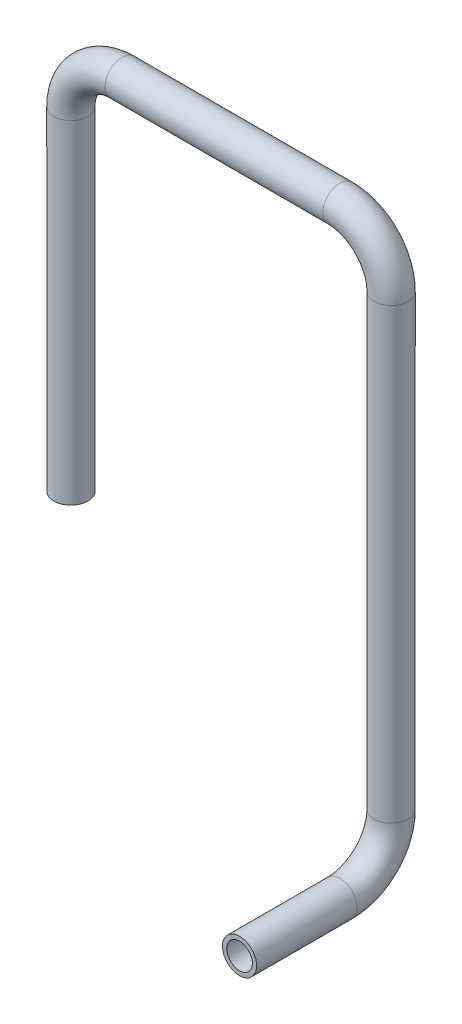
ISO-10303-21;
HEADER;
FILE_DESCRIPTION(('STEP AP214'),'2;1');
FILE_NAME('part.step','',(''),(''),'','','');
FILE_SCHEMA(('AUTOMOTIVE_DESIGN { 1 0 10303 214 1 1 1 1 }'));
ENDSEC;
DATA;
#1=APPLICATION_CONTEXT('core data for automotive mechanical design processes');
#2=APPLICATION_PROTOCOL_DEFINITION('international standard','automotive_design',2000,#1);
#3=PRODUCT_CONTEXT('',#1,'mechanical');
#4=PRODUCT('Part','Part','',(#3));
#5=PRODUCT_RELATED_PRODUCT_CATEGORY('part','',(#4));
#6=PRODUCT_DEFINITION_FORMATION('','',#4);
#7=PRODUCT_DEFINITION_CONTEXT('part definition',#1,'design');
#8=PRODUCT_DEFINITION('design','',#6,#7);
#9=PRODUCT_DEFINITION_SHAPE('','',#8);
#10=(LENGTH_UNIT() NAMED_UNIT(*) SI_UNIT(.MILLI.,.METRE.));
#11=(NAMED_UNIT(*) PLANE_ANGLE_UNIT() SI_UNIT($,.RADIAN.));
#12=(NAMED_UNIT(*) SI_UNIT($,.STERADIAN.) SOLID_ANGLE_UNIT());
#13=UNCERTAINTY_MEASURE_WITH_UNIT(LENGTH_MEASURE(1.E-05),#10,'distance_accuracy_value','');
#14=(GEOMETRIC_REPRESENTATION_CONTEXT(3) GLOBAL_UNCERTAINTY_ASSIGNED_CONTEXT((#13)) GLOBAL_UNIT_ASSIGNED_CONTEXT((#10,
#11,#12)) REPRESENTATION_CONTEXT('',''));
#15=CARTESIAN_POINT('',(0.,0.,0.));
#16=DIRECTION('',(0.,0.,1.));
#17=DIRECTION('',(1.,0.,0.));
#18=AXIS2_PLACEMENT_3D('',#15,#16,#17);
#19=CARTESIAN_POINT('',(180.,21.,-89.5));
#20=DIRECTION('',(0.,0.,1.));
#21=DIRECTION('',(0.,1.,0.));
#22=AXIS2_PLACEMENT_3D('',#19,#20,#21);
#23=PLANE('',#22);
#24=CARTESIAN_POINT('',(180.,21.,-89.5));
#25=DIRECTION('',(0.,0.,1.));
#26=DIRECTION('',(0.,1.,0.));
#27=AXIS2_PLACEMENT_3D('',#24,#25,#26);
#28=CIRCLE('',#27,3.);
#29=CARTESIAN_POINT('',(180.,24.,-89.5));
#30=VERTEX_POINT('',#29);
#31=EDGE_CURVE('E263',#30,#30,#28,.T.);
#32=ORIENTED_EDGE('',*,*,#31,.F.);
#33=EDGE_LOOP('',(#32));
#34=FACE_BOUND('',#33,.T.);
#35=CARTESIAN_POINT('',(180.,21.,-89.5));
#36=DIRECTION('',(0.,0.,1.));
#37=DIRECTION('',(1.,0.,0.));
#38=AXIS2_PLACEMENT_3D('',#35,#36,#37);
#39=CIRCLE('',#38,4.);
#40=CARTESIAN_POINT('',(184.,21.,-89.5));
#41=VERTEX_POINT('',#40);
#42=EDGE_CURVE('E75',#41,#41,#39,.T.);
#43=ORIENTED_EDGE('',*,*,#42,.T.);
#44=EDGE_LOOP('',(#43));
#45=FACE_BOUND('',#44,.T.);
#46=ADVANCED_FACE('F52',(#34,#45),#23,.T.);
#47=CARTESIAN_POINT('',(105.,60.,-125.));
#48=DIRECTION('',(0.,1.,0.));
#49=DIRECTION('',(0.,0.,1.));
#50=AXIS2_PLACEMENT_3D('',#47,#48,#49);
#51=PLANE('',#50);
#52=CARTESIAN_POINT('',(105.,60.,-125.));
#53=DIRECTION('',(0.,1.,0.));
#54=DIRECTION('',(0.,0.,1.));
#55=AXIS2_PLACEMENT_3D('',#52,#53,#54);
#56=CIRCLE('',#55,3.);
#57=CARTESIAN_POINT('',(105.,60.,-122.));
#58=VERTEX_POINT('',#57);
#59=EDGE_CURVE('E73',#58,#58,#56,.T.);
#60=ORIENTED_EDGE('',*,*,#59,.T.);
#61=EDGE_LOOP('',(#60));
#62=FACE_BOUND('',#61,.T.);
#63=CARTESIAN_POINT('',(105.,60.,-125.));
#64=DIRECTION('',(0.,1.,0.));
#65=DIRECTION('',(0.,0.,1.));
#66=AXIS2_PLACEMENT_3D('',#63,#64,#65);
#67=CIRCLE('',#66,4.);
#68=CARTESIAN_POINT('',(105.,60.,-121.));
#69=VERTEX_POINT('',#68);
#70=EDGE_CURVE('E11',#69,#69,#67,.T.);
#71=ORIENTED_EDGE('',*,*,#70,.F.);
#72=EDGE_LOOP('',(#71));
#73=FACE_BOUND('',#72,.T.);
#74=ADVANCED_FACE('F149',(#62,#73),#51,.F.);
#75=CARTESIAN_POINT('',(180.,21.,-89.5));
#76=DIRECTION('',(0.,0.,-1.));
#77=DIRECTION('',(-1.,0.,0.));
#78=AXIS2_PLACEMENT_3D('',#75,#76,#77);
#79=CYLINDRICAL_SURFACE('',#78,4.);
#80=CARTESIAN_POINT('',(180.,21.,-113.));
#81=DIRECTION('',(0.,0.,-1.));
#82=DIRECTION('',(-1.,0.,0.));
#83=AXIS2_PLACEMENT_3D('',#80,#81,#82);
#84=CIRCLE('',#83,4.);
#85=CARTESIAN_POINT('',(180.,17.,-113.));
#86=VERTEX_POINT('',#85);
#87=EDGE_CURVE('E74',#86,#86,#84,.F.);
#88=ORIENTED_EDGE('',*,*,#87,.T.);
#89=EDGE_LOOP('',(#88));
#90=FACE_BOUND('',#89,.T.);
#91=ORIENTED_EDGE('',*,*,#42,.F.);
#92=EDGE_LOOP('',(#91));
#93=FACE_BOUND('',#92,.T.);
#94=ADVANCED_FACE('F155',(#90,#93),#79,.T.);
#95=CARTESIAN_POINT('',(180.,33.,-113.));
#96=DIRECTION('',(1.,0.,0.));
#97=DIRECTION('',(0.,0.,-1.));
#98=AXIS2_PLACEMENT_3D('',#95,#96,#97);
#99=TOROIDAL_SURFACE('',#98,12.,4.);
#100=CARTESIAN_POINT('',(180.,33.,-125.));
#101=DIRECTION('',(0.,-1.,0.));
#102=DIRECTION('',(0.,0.,-1.));
#103=AXIS2_PLACEMENT_3D('',#100,#101,#102);
#104=CIRCLE('',#103,4.);
#105=CARTESIAN_POINT('',(180.,33.,-129.));
#106=VERTEX_POINT('',#105);
#107=EDGE_CURVE('E78',#106,#106,#104,.T.);
#108=CARTESIAN_POINT('',(180.,33.,-113.));
#109=DIRECTION('',(1.,0.,0.));
#110=DIRECTION('',(0.,0.,-1.));
#111=AXIS2_PLACEMENT_3D('',#108,#109,#110);
#112=CIRCLE('',#111,16.);
#113=EDGE_CURVE('',#86,#106,#112,.T.);
#114=ORIENTED_EDGE('',*,*,#87,.F.);
#115=ORIENTED_EDGE('',*,*,#107,.T.);
#116=ORIENTED_EDGE('',*,*,#113,.T.);
#117=ORIENTED_EDGE('',*,*,#113,.F.);
#118=EDGE_LOOP('',(#114,#116,#115,#117));
#119=FACE_BOUND('',#118,.T.);
#120=ADVANCED_FACE('F158',(#119),#99,.T.);
#121=CARTESIAN_POINT('',(180.,33.,-125.));
#122=DIRECTION('',(0.,1.,0.));
#123=DIRECTION('',(0.,0.,1.));
#124=AXIS2_PLACEMENT_3D('',#121,#122,#123);
#125=CYLINDRICAL_SURFACE('',#124,4.);
#126=CARTESIAN_POINT('',(180.,138.,-125.));
#127=DIRECTION('',(0.,1.,0.));
#128=DIRECTION('',(0.,0.,1.));
#129=AXIS2_PLACEMENT_3D('',#126,#127,#128);
#130=CIRCLE('',#129,4.);
#131=CARTESIAN_POINT('',(184.,138.,-125.));
#132=VERTEX_POINT('',#131);
#133=EDGE_CURVE('E91',#132,#132,#130,.F.);
#134=ORIENTED_EDGE('',*,*,#133,.T.);
#135=EDGE_LOOP('',(#134));
#136=FACE_BOUND('',#135,.T.);
#137=ORIENTED_EDGE('',*,*,#107,.F.);
#138=EDGE_LOOP('',(#137));
#139=FACE_BOUND('',#138,.T.);
#140=ADVANCED_FACE('F109',(#136,#139),#125,.T.);
#141=CARTESIAN_POINT('',(168.,138.,-125.));
#142=DIRECTION('',(0.,0.,1.));
#143=DIRECTION('',(1.,0.,0.));
#144=AXIS2_PLACEMENT_3D('',#141,#142,#143);
#145=TOROIDAL_SURFACE('',#144,12.,4.);
#146=CARTESIAN_POINT('',(168.,150.,-125.));
#147=DIRECTION('',(1.,0.,0.));
#148=DIRECTION('',(0.,1.,0.));
#149=AXIS2_PLACEMENT_3D('',#146,#147,#148);
#150=CIRCLE('',#149,4.);
#151=CARTESIAN_POINT('',(168.,154.,-125.));
#152=VERTEX_POINT('',#151);
#153=EDGE_CURVE('E67',#152,#152,#150,.T.);
#154=CARTESIAN_POINT('',(168.,138.,-125.));
#155=DIRECTION('',(0.,0.,1.));
#156=DIRECTION('',(1.,0.,0.));
#157=AXIS2_PLACEMENT_3D('',#154,#155,#156);
#158=CIRCLE('',#157,16.);
#159=EDGE_CURVE('',#132,#152,#158,.T.);
#160=ORIENTED_EDGE('',*,*,#133,.F.);
#161=ORIENTED_EDGE('',*,*,#153,.T.);
#162=ORIENTED_EDGE('',*,*,#159,.T.);
#163=ORIENTED_EDGE('',*,*,#159,.F.);
#164=EDGE_LOOP('',(#160,#162,#161,#163));
#165=FACE_BOUND('',#164,.T.);
#166=ADVANCED_FACE('F98',(#165),#145,.T.);
#167=CARTESIAN_POINT('',(168.,150.,-125.));
#168=DIRECTION('',(-1.,0.,0.));
#169=DIRECTION('',(0.,0.,1.));
#170=AXIS2_PLACEMENT_3D('',#167,#168,#169);
#171=CYLINDRICAL_SURFACE('',#170,4.);
#172=CARTESIAN_POINT('',(117.,150.,-125.));
#173=DIRECTION('',(-1.,0.,0.));
#174=DIRECTION('',(0.,0.,1.));
#175=AXIS2_PLACEMENT_3D('',#172,#173,#174);
#176=CIRCLE('',#175,4.);
#177=CARTESIAN_POINT('',(117.,154.,-125.));
#178=VERTEX_POINT('',#177);
#179=EDGE_CURVE('E63',#178,#178,#176,.F.);
#180=ORIENTED_EDGE('',*,*,#179,.T.);
#181=EDGE_LOOP('',(#180));
#182=FACE_BOUND('',#181,.T.);
#183=ORIENTED_EDGE('',*,*,#153,.F.);
#184=EDGE_LOOP('',(#183));
#185=FACE_BOUND('',#184,.T.);
#186=ADVANCED_FACE('F101',(#182,#185),#171,.T.);
#187=CARTESIAN_POINT('',(117.,138.,-125.));
#188=DIRECTION('',(0.,0.,1.));
#189=DIRECTION('',(1.,0.,0.));
#190=AXIS2_PLACEMENT_3D('',#187,#188,#189);
#191=TOROIDAL_SURFACE('',#190,12.,4.);
#192=CARTESIAN_POINT('',(105.,138.,-125.));
#193=DIRECTION('',(0.,1.,0.));
#194=DIRECTION('',(-1.,0.,0.));
#195=AXIS2_PLACEMENT_3D('',#192,#193,#194);
#196=CIRCLE('',#195,4.);
#197=CARTESIAN_POINT('',(101.,138.,-125.));
#198=VERTEX_POINT('',#197);
#199=EDGE_CURVE('E58',#198,#198,#196,.T.);
#200=CARTESIAN_POINT('',(117.,138.,-125.));
#201=DIRECTION('',(0.,0.,1.));
#202=DIRECTION('',(1.,0.,0.));
#203=AXIS2_PLACEMENT_3D('',#200,#201,#202);
#204=CIRCLE('',#203,16.);
#205=EDGE_CURVE('',#178,#198,#204,.T.);
#206=ORIENTED_EDGE('',*,*,#179,.F.);
#207=ORIENTED_EDGE('',*,*,#199,.T.);
#208=ORIENTED_EDGE('',*,*,#205,.T.);
#209=ORIENTED_EDGE('',*,*,#205,.F.);
#210=EDGE_LOOP('',(#206,#208,#207,#209));
#211=FACE_BOUND('',#210,.T.);
#212=ADVANCED_FACE('F103',(#211),#191,.T.);
#213=CARTESIAN_POINT('',(105.,138.,-125.));
#214=DIRECTION('',(0.,-1.,0.));
#215=DIRECTION('',(0.,0.,-1.));
#216=AXIS2_PLACEMENT_3D('',#213,#214,#215);
#217=CYLINDRICAL_SURFACE('',#216,4.);
#218=ORIENTED_EDGE('',*,*,#70,.T.);
#219=EDGE_LOOP('',(#218));
#220=FACE_BOUND('',#219,.T.);
#221=ORIENTED_EDGE('',*,*,#199,.F.);
#222=EDGE_LOOP('',(#221));
#223=FACE_BOUND('',#222,.T.);
#224=ADVANCED_FACE('F54',(#220,#223),#217,.T.);
#225=CARTESIAN_POINT('',(180.,21.,-89.5));
#226=DIRECTION('',(0.,0.,-1.));
#227=DIRECTION('',(-1.,0.,0.));
#228=AXIS2_PLACEMENT_3D('',#225,#226,#227);
#229=CYLINDRICAL_SURFACE('',#228,3.);
#230=CARTESIAN_POINT('',(180.,21.,-113.));
#231=DIRECTION('',(0.,0.,1.));
#232=DIRECTION('',(0.,1.,0.));
#233=AXIS2_PLACEMENT_3D('',#230,#231,#232);
#234=CIRCLE('',#233,3.);
#235=CARTESIAN_POINT('',(180.,18.,-113.));
#236=VERTEX_POINT('',#235);
#237=EDGE_CURVE('E262',#236,#236,#234,.T.);
#238=ORIENTED_EDGE('',*,*,#237,.F.);
#239=EDGE_LOOP('',(#238));
#240=FACE_BOUND('',#239,.T.);
#241=ORIENTED_EDGE('',*,*,#31,.T.);
#242=EDGE_LOOP('',(#241));
#243=FACE_BOUND('',#242,.T.);
#244=ADVANCED_FACE('F114',(#240,#243),#229,.F.);
#245=CARTESIAN_POINT('',(180.,33.,-113.));
#246=DIRECTION('',(1.,0.,0.));
#247=DIRECTION('',(0.,0.,-1.));
#248=AXIS2_PLACEMENT_3D('',#245,#246,#247);
#249=TOROIDAL_SURFACE('',#248,12.,3.);
#250=CARTESIAN_POINT('',(180.,33.,-125.));
#251=DIRECTION('',(0.,-1.,0.));
#252=DIRECTION('',(0.,0.,1.));
#253=AXIS2_PLACEMENT_3D('',#250,#251,#252);
#254=CIRCLE('',#253,3.);
#255=CARTESIAN_POINT('',(180.,33.,-128.));
#256=VERTEX_POINT('',#255);
#257=EDGE_CURVE('E270',#256,#256,#254,.T.);
#258=CARTESIAN_POINT('',(180.,33.,-113.));
#259=DIRECTION('',(1.,0.,0.));
#260=DIRECTION('',(0.,0.,-1.));
#261=AXIS2_PLACEMENT_3D('',#258,#259,#260);
#262=CIRCLE('',#261,15.);
#263=EDGE_CURVE('',#236,#256,#262,.T.);
#264=ORIENTED_EDGE('',*,*,#237,.T.);
#265=ORIENTED_EDGE('',*,*,#257,.F.);
#266=ORIENTED_EDGE('',*,*,#263,.T.);
#267=ORIENTED_EDGE('',*,*,#263,.F.);
#268=EDGE_LOOP('',(#264,#266,#265,#267));
#269=FACE_BOUND('',#268,.T.);
#270=ADVANCED_FACE('F120',(#269),#249,.F.);
#271=CARTESIAN_POINT('',(180.,33.,-125.));
#272=DIRECTION('',(0.,1.,0.));
#273=DIRECTION('',(0.,0.,1.));
#274=AXIS2_PLACEMENT_3D('',#271,#272,#273);
#275=CYLINDRICAL_SURFACE('',#274,3.);
#276=CARTESIAN_POINT('',(180.,138.,-125.));
#277=DIRECTION('',(0.,-1.,0.));
#278=DIRECTION('',(0.,0.,1.));
#279=AXIS2_PLACEMENT_3D('',#276,#277,#278);
#280=CIRCLE('',#279,3.);
#281=CARTESIAN_POINT('',(183.,138.,-125.));
#282=VERTEX_POINT('',#281);
#283=EDGE_CURVE('E275',#282,#282,#280,.T.);
#284=ORIENTED_EDGE('',*,*,#283,.F.);
#285=EDGE_LOOP('',(#284));
#286=FACE_BOUND('',#285,.T.);
#287=ORIENTED_EDGE('',*,*,#257,.T.);
#288=EDGE_LOOP('',(#287));
#289=FACE_BOUND('',#288,.T.);
#290=ADVANCED_FACE('F122',(#286,#289),#275,.F.);
#291=CARTESIAN_POINT('',(168.,138.,-125.));
#292=DIRECTION('',(0.,0.,1.));
#293=DIRECTION('',(1.,0.,0.));
#294=AXIS2_PLACEMENT_3D('',#291,#292,#293);
#295=TOROIDAL_SURFACE('',#294,12.,3.);
#296=CARTESIAN_POINT('',(168.,150.,-125.));
#297=DIRECTION('',(1.,0.,0.));
#298=DIRECTION('',(0.,0.,1.));
#299=AXIS2_PLACEMENT_3D('',#296,#297,#298);
#300=CIRCLE('',#299,3.);
#301=CARTESIAN_POINT('',(168.,153.,-125.));
#302=VERTEX_POINT('',#301);
#303=EDGE_CURVE('E274',#302,#302,#300,.T.);
#304=CARTESIAN_POINT('',(168.,138.,-125.));
#305=DIRECTION('',(0.,0.,1.));
#306=DIRECTION('',(1.,0.,0.));
#307=AXIS2_PLACEMENT_3D('',#304,#305,#306);
#308=CIRCLE('',#307,15.);
#309=EDGE_CURVE('',#282,#302,#308,.T.);
#310=ORIENTED_EDGE('',*,*,#283,.T.);
#311=ORIENTED_EDGE('',*,*,#303,.F.);
#312=ORIENTED_EDGE('',*,*,#309,.T.);
#313=ORIENTED_EDGE('',*,*,#309,.F.);
#314=EDGE_LOOP('',(#310,#312,#311,#313));
#315=FACE_BOUND('',#314,.T.);
#316=ADVANCED_FACE('F135',(#315),#295,.F.);
#317=CARTESIAN_POINT('',(168.,150.,-125.));
#318=DIRECTION('',(-1.,0.,0.));
#319=DIRECTION('',(0.,0.,1.));
#320=AXIS2_PLACEMENT_3D('',#317,#318,#319);
#321=CYLINDRICAL_SURFACE('',#320,3.);
#322=CARTESIAN_POINT('',(117.,150.,-125.));
#323=DIRECTION('',(1.,0.,0.));
#324=DIRECTION('',(0.,0.,1.));
#325=AXIS2_PLACEMENT_3D('',#322,#323,#324);
#326=CIRCLE('',#325,3.);
#327=CARTESIAN_POINT('',(117.,153.,-125.));
#328=VERTEX_POINT('',#327);
#329=EDGE_CURVE('E87',#328,#328,#326,.T.);
#330=ORIENTED_EDGE('',*,*,#329,.F.);
#331=EDGE_LOOP('',(#330));
#332=FACE_BOUND('',#331,.T.);
#333=ORIENTED_EDGE('',*,*,#303,.T.);
#334=EDGE_LOOP('',(#333));
#335=FACE_BOUND('',#334,.T.);
#336=ADVANCED_FACE('F136',(#332,#335),#321,.F.);
#337=CARTESIAN_POINT('',(117.,138.,-125.));
#338=DIRECTION('',(0.,0.,1.));
#339=DIRECTION('',(1.,0.,0.));
#340=AXIS2_PLACEMENT_3D('',#337,#338,#339);
#341=TOROIDAL_SURFACE('',#340,12.,3.);
#342=CARTESIAN_POINT('',(105.,138.,-125.));
#343=DIRECTION('',(0.,1.,0.));
#344=DIRECTION('',(0.,0.,1.));
#345=AXIS2_PLACEMENT_3D('',#342,#343,#344);
#346=CIRCLE('',#345,3.);
#347=CARTESIAN_POINT('',(102.,138.,-125.));
#348=VERTEX_POINT('',#347);
#349=EDGE_CURVE('E85',#348,#348,#346,.T.);
#350=CARTESIAN_POINT('',(117.,138.,-125.));
#351=DIRECTION('',(0.,0.,1.));
#352=DIRECTION('',(1.,0.,0.));
#353=AXIS2_PLACEMENT_3D('',#350,#351,#352);
#354=CIRCLE('',#353,15.);
#355=EDGE_CURVE('',#328,#348,#354,.T.);
#356=ORIENTED_EDGE('',*,*,#329,.T.);
#357=ORIENTED_EDGE('',*,*,#349,.F.);
#358=ORIENTED_EDGE('',*,*,#355,.T.);
#359=ORIENTED_EDGE('',*,*,#355,.F.);
#360=EDGE_LOOP('',(#356,#358,#357,#359));
#361=FACE_BOUND('',#360,.T.);
#362=ADVANCED_FACE('F139',(#361),#341,.F.);
#363=CARTESIAN_POINT('',(105.,138.,-125.));
#364=DIRECTION('',(0.,-1.,0.));
#365=DIRECTION('',(0.,0.,-1.));
#366=AXIS2_PLACEMENT_3D('',#363,#364,#365);
#367=CYLINDRICAL_SURFACE('',#366,3.);
#368=ORIENTED_EDGE('',*,*,#59,.F.);
#369=EDGE_LOOP('',(#368));
#370=FACE_BOUND('',#369,.T.);
#371=ORIENTED_EDGE('',*,*,#349,.T.);
#372=EDGE_LOOP('',(#371));
#373=FACE_BOUND('',#372,.T.);
#374=ADVANCED_FACE('F145',(#370,#373),#367,.F.);
#375=CLOSED_SHELL('',(#46,#74,#94,#120,#140,#166,#186,#212,#224,#244,#270,#290,#316,#336,#362,#374));
#376=MANIFOLD_SOLID_BREP('B2',#375);
#377=ADVANCED_BREP_SHAPE_REPRESENTATION('',(#18,#376),#14);
#378=SHAPE_DEFINITION_REPRESENTATION(#9,#377);
ENDSEC;
END-ISO-10303-21;
